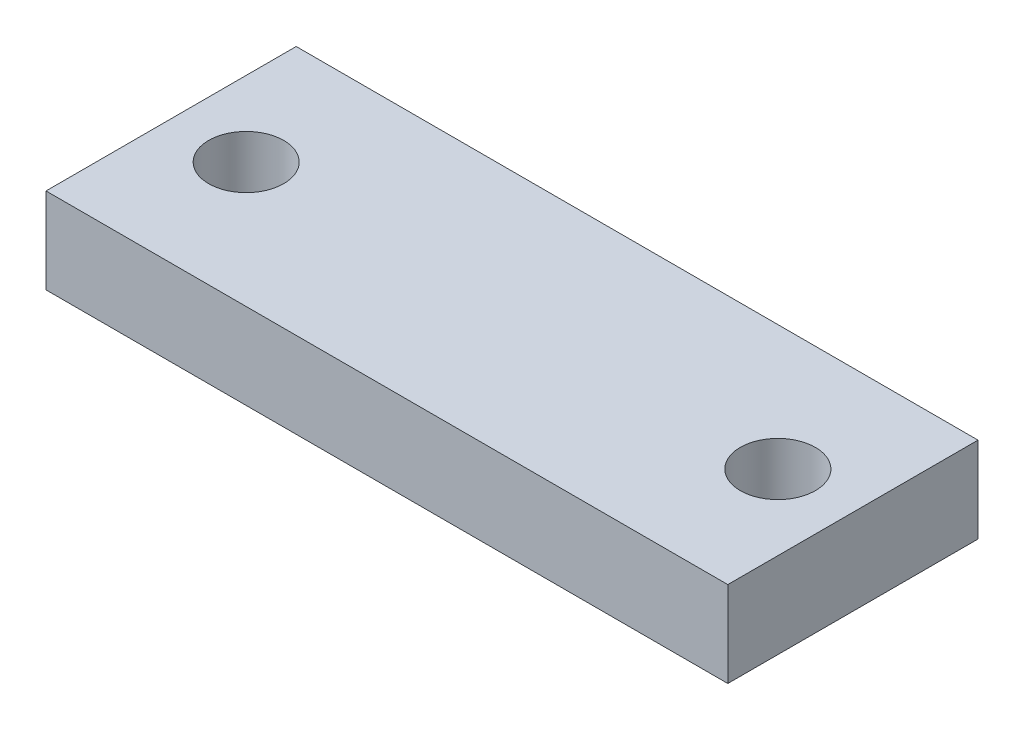
ISO-10303-21;
HEADER;
FILE_DESCRIPTION(('STEP AP214'),'2;1');
FILE_NAME('part.step','',(''),(''),'','','');
FILE_SCHEMA(('AUTOMOTIVE_DESIGN { 1 0 10303 214 1 1 1 1 }'));
ENDSEC;
DATA;
#1=APPLICATION_CONTEXT('core data for automotive mechanical design processes');
#2=APPLICATION_PROTOCOL_DEFINITION('international standard','automotive_design',2000,#1);
#3=PRODUCT_CONTEXT('',#1,'mechanical');
#4=PRODUCT('Part','Part','',(#3));
#5=PRODUCT_RELATED_PRODUCT_CATEGORY('part','',(#4));
#6=PRODUCT_DEFINITION_FORMATION('','',#4);
#7=PRODUCT_DEFINITION_CONTEXT('part definition',#1,'design');
#8=PRODUCT_DEFINITION('design','',#6,#7);
#9=PRODUCT_DEFINITION_SHAPE('','',#8);
#10=(LENGTH_UNIT() NAMED_UNIT(*) SI_UNIT(.MILLI.,.METRE.));
#11=(NAMED_UNIT(*) PLANE_ANGLE_UNIT() SI_UNIT($,.RADIAN.));
#12=(NAMED_UNIT(*) SI_UNIT($,.STERADIAN.) SOLID_ANGLE_UNIT());
#13=UNCERTAINTY_MEASURE_WITH_UNIT(LENGTH_MEASURE(1.E-05),#10,'distance_accuracy_value','');
#14=(GEOMETRIC_REPRESENTATION_CONTEXT(3) GLOBAL_UNCERTAINTY_ASSIGNED_CONTEXT((#13)) GLOBAL_UNIT_ASSIGNED_CONTEXT((#10,
#11,#12)) REPRESENTATION_CONTEXT('',''));
#15=CARTESIAN_POINT('',(0.,0.,0.));
#16=DIRECTION('',(0.,0.,1.));
#17=DIRECTION('',(1.,0.,0.));
#18=AXIS2_PLACEMENT_3D('',#15,#16,#17);
#19=CARTESIAN_POINT('',(0.,6.85,0.));
#20=DIRECTION('',(0.,1.,0.));
#21=DIRECTION('',(0.,0.,1.));
#22=AXIS2_PLACEMENT_3D('',#19,#20,#21);
#23=PLANE('',#22);
#24=CARTESIAN_POINT('',(48.5,6.85,10.));
#25=DIRECTION('',(0.,1.,0.));
#26=DIRECTION('',(0.,0.,1.));
#27=AXIS2_PLACEMENT_3D('',#24,#25,#26);
#28=CIRCLE('',#27,3.);
#29=CARTESIAN_POINT('',(48.5,6.85,7.));
#30=VERTEX_POINT('',#29);
#31=EDGE_CURVE('E106',#30,#30,#28,.T.);
#32=ORIENTED_EDGE('',*,*,#31,.F.);
#33=EDGE_LOOP('',(#32));
#34=FACE_BOUND('',#33,.T.);
#35=DIRECTION('',(0.,0.,1.));
#36=VECTOR('',#35,1.);
#37=CARTESIAN_POINT('',(0.,6.85,0.));
#38=LINE('',#37,#36);
#39=CARTESIAN_POINT('',(0.,6.85,0.));
#40=VERTEX_POINT('',#39);
#41=CARTESIAN_POINT('',(0.,6.85,20.));
#42=VERTEX_POINT('',#41);
#43=EDGE_CURVE('E91',#40,#42,#38,.T.);
#44=ORIENTED_EDGE('',*,*,#43,.T.);
#45=DIRECTION('',(1.,0.,0.));
#46=VECTOR('',#45,1.);
#47=CARTESIAN_POINT('',(0.,6.85,20.));
#48=LINE('',#47,#46);
#49=CARTESIAN_POINT('',(54.5,6.85,20.));
#50=VERTEX_POINT('',#49);
#51=EDGE_CURVE('E86',#42,#50,#48,.T.);
#52=ORIENTED_EDGE('',*,*,#51,.T.);
#53=DIRECTION('',(0.,0.,-1.));
#54=VECTOR('',#53,1.);
#55=CARTESIAN_POINT('',(54.5,6.85,0.));
#56=LINE('',#55,#54);
#57=CARTESIAN_POINT('',(54.5,6.85,0.));
#58=VERTEX_POINT('',#57);
#59=EDGE_CURVE('E89',#50,#58,#56,.T.);
#60=ORIENTED_EDGE('',*,*,#59,.T.);
#61=DIRECTION('',(-1.,0.,0.));
#62=VECTOR('',#61,1.);
#63=CARTESIAN_POINT('',(0.,6.85,0.));
#64=LINE('',#63,#62);
#65=EDGE_CURVE('E56',#58,#40,#64,.T.);
#66=ORIENTED_EDGE('',*,*,#65,.T.);
#67=EDGE_LOOP('',(#44,#52,#60,#66));
#68=FACE_BOUND('',#67,.T.);
#69=CARTESIAN_POINT('',(6.,6.85,10.));
#70=DIRECTION('',(0.,1.,0.));
#71=DIRECTION('',(0.,0.,-1.));
#72=AXIS2_PLACEMENT_3D('',#69,#70,#71);
#73=CIRCLE('',#72,3.00000000000001);
#74=CARTESIAN_POINT('',(6.,6.85,7.));
#75=VERTEX_POINT('',#74);
#76=EDGE_CURVE('E121',#75,#75,#73,.T.);
#77=ORIENTED_EDGE('',*,*,#76,.F.);
#78=EDGE_LOOP('',(#77));
#79=FACE_BOUND('',#78,.T.);
#80=ADVANCED_FACE('F39',(#34,#68,#79),#23,.T.);
#81=CARTESIAN_POINT('',(0.,0.,0.));
#82=DIRECTION('',(0.,1.,0.));
#83=DIRECTION('',(0.,0.,1.));
#84=AXIS2_PLACEMENT_3D('',#81,#82,#83);
#85=PLANE('',#84);
#86=DIRECTION('',(0.,0.,1.));
#87=VECTOR('',#86,1.);
#88=CARTESIAN_POINT('',(0.,0.,0.));
#89=LINE('',#88,#87);
#90=CARTESIAN_POINT('',(0.,0.,0.));
#91=VERTEX_POINT('',#90);
#92=CARTESIAN_POINT('',(0.,0.,20.));
#93=VERTEX_POINT('',#92);
#94=EDGE_CURVE('E103',#91,#93,#89,.T.);
#95=ORIENTED_EDGE('',*,*,#94,.F.);
#96=DIRECTION('',(-1.,0.,0.));
#97=VECTOR('',#96,1.);
#98=CARTESIAN_POINT('',(0.,0.,0.));
#99=LINE('',#98,#97);
#100=CARTESIAN_POINT('',(54.5,0.,0.));
#101=VERTEX_POINT('',#100);
#102=EDGE_CURVE('E79',#101,#91,#99,.T.);
#103=ORIENTED_EDGE('',*,*,#102,.F.);
#104=DIRECTION('',(0.,0.,-1.));
#105=VECTOR('',#104,1.);
#106=CARTESIAN_POINT('',(54.5,0.,0.));
#107=LINE('',#106,#105);
#108=CARTESIAN_POINT('',(54.5,0.,20.));
#109=VERTEX_POINT('',#108);
#110=EDGE_CURVE('E73',#109,#101,#107,.T.);
#111=ORIENTED_EDGE('',*,*,#110,.F.);
#112=DIRECTION('',(1.,0.,0.));
#113=VECTOR('',#112,1.);
#114=CARTESIAN_POINT('',(0.,0.,20.));
#115=LINE('',#114,#113);
#116=EDGE_CURVE('E95',#93,#109,#115,.T.);
#117=ORIENTED_EDGE('',*,*,#116,.F.);
#118=EDGE_LOOP('',(#95,#103,#111,#117));
#119=FACE_BOUND('',#118,.T.);
#120=CARTESIAN_POINT('',(48.5,0.,10.));
#121=DIRECTION('',(0.,1.,0.));
#122=DIRECTION('',(0.,0.,1.));
#123=AXIS2_PLACEMENT_3D('',#120,#121,#122);
#124=CIRCLE('',#123,3.);
#125=CARTESIAN_POINT('',(48.5,0.,7.));
#126=VERTEX_POINT('',#125);
#127=EDGE_CURVE('E118',#126,#126,#124,.T.);
#128=ORIENTED_EDGE('',*,*,#127,.T.);
#129=EDGE_LOOP('',(#128));
#130=FACE_BOUND('',#129,.T.);
#131=CARTESIAN_POINT('',(6.,0.,10.));
#132=DIRECTION('',(0.,1.,0.));
#133=DIRECTION('',(0.,0.,-1.));
#134=AXIS2_PLACEMENT_3D('',#131,#132,#133);
#135=CIRCLE('',#134,3.00000000000001);
#136=CARTESIAN_POINT('',(6.,0.,7.));
#137=VERTEX_POINT('',#136);
#138=EDGE_CURVE('E124',#137,#137,#135,.T.);
#139=ORIENTED_EDGE('',*,*,#138,.T.);
#140=EDGE_LOOP('',(#139));
#141=FACE_BOUND('',#140,.T.);
#142=ADVANCED_FACE('F114',(#119,#130,#141),#85,.F.);
#143=CARTESIAN_POINT('',(0.,6.85,0.));
#144=DIRECTION('',(1.,0.,0.));
#145=DIRECTION('',(0.,0.,-1.));
#146=AXIS2_PLACEMENT_3D('',#143,#144,#145);
#147=PLANE('',#146);
#148=ORIENTED_EDGE('',*,*,#94,.T.);
#149=DIRECTION('',(0.,-1.,0.));
#150=VECTOR('',#149,1.);
#151=CARTESIAN_POINT('',(0.,6.85,20.));
#152=LINE('',#151,#150);
#153=EDGE_CURVE('E11',#42,#93,#152,.T.);
#154=ORIENTED_EDGE('',*,*,#153,.F.);
#155=ORIENTED_EDGE('',*,*,#43,.F.);
#156=DIRECTION('',(0.,-1.,0.));
#157=VECTOR('',#156,1.);
#158=CARTESIAN_POINT('',(0.,6.85,0.));
#159=LINE('',#158,#157);
#160=EDGE_CURVE('E99',#40,#91,#159,.T.);
#161=ORIENTED_EDGE('',*,*,#160,.T.);
#162=EDGE_LOOP('',(#148,#154,#155,#161));
#163=FACE_BOUND('',#162,.T.);
#164=ADVANCED_FACE('F41',(#163),#147,.F.);
#165=CARTESIAN_POINT('',(0.,6.85,20.));
#166=DIRECTION('',(0.,0.,-1.));
#167=DIRECTION('',(-1.,0.,0.));
#168=AXIS2_PLACEMENT_3D('',#165,#166,#167);
#169=PLANE('',#168);
#170=ORIENTED_EDGE('',*,*,#116,.T.);
#171=DIRECTION('',(0.,-1.,0.));
#172=VECTOR('',#171,1.);
#173=CARTESIAN_POINT('',(54.5,6.85,20.));
#174=LINE('',#173,#172);
#175=EDGE_CURVE('E48',#50,#109,#174,.T.);
#176=ORIENTED_EDGE('',*,*,#175,.F.);
#177=ORIENTED_EDGE('',*,*,#51,.F.);
#178=ORIENTED_EDGE('',*,*,#153,.T.);
#179=EDGE_LOOP('',(#170,#176,#177,#178));
#180=FACE_BOUND('',#179,.T.);
#181=ADVANCED_FACE('F94',(#180),#169,.F.);
#182=CARTESIAN_POINT('',(54.5,6.85,0.));
#183=DIRECTION('',(-1.,0.,0.));
#184=DIRECTION('',(0.,0.,1.));
#185=AXIS2_PLACEMENT_3D('',#182,#183,#184);
#186=PLANE('',#185);
#187=ORIENTED_EDGE('',*,*,#110,.T.);
#188=DIRECTION('',(0.,-1.,0.));
#189=VECTOR('',#188,1.);
#190=CARTESIAN_POINT('',(54.5,6.85,0.));
#191=LINE('',#190,#189);
#192=EDGE_CURVE('E96',#58,#101,#191,.T.);
#193=ORIENTED_EDGE('',*,*,#192,.F.);
#194=ORIENTED_EDGE('',*,*,#59,.F.);
#195=ORIENTED_EDGE('',*,*,#175,.T.);
#196=EDGE_LOOP('',(#187,#193,#194,#195));
#197=FACE_BOUND('',#196,.T.);
#198=ADVANCED_FACE('F97',(#197),#186,.F.);
#199=CARTESIAN_POINT('',(0.,6.85,0.));
#200=DIRECTION('',(0.,0.,1.));
#201=DIRECTION('',(1.,0.,0.));
#202=AXIS2_PLACEMENT_3D('',#199,#200,#201);
#203=PLANE('',#202);
#204=ORIENTED_EDGE('',*,*,#102,.T.);
#205=ORIENTED_EDGE('',*,*,#160,.F.);
#206=ORIENTED_EDGE('',*,*,#65,.F.);
#207=ORIENTED_EDGE('',*,*,#192,.T.);
#208=EDGE_LOOP('',(#204,#205,#206,#207));
#209=FACE_BOUND('',#208,.T.);
#210=ADVANCED_FACE('F111',(#209),#203,.F.);
#211=CARTESIAN_POINT('',(48.5,6.85,10.));
#212=DIRECTION('',(0.,-1.,0.));
#213=DIRECTION('',(0.,0.,-1.));
#214=AXIS2_PLACEMENT_3D('',#211,#212,#213);
#215=CYLINDRICAL_SURFACE('',#214,3.);
#216=CARTESIAN_POINT('',(48.5,6.85,7.));
#217=CARTESIAN_POINT('',(48.5,6.77864583333333,7.));
#218=CARTESIAN_POINT('',(48.5,6.70729166666667,7.));
#219=CARTESIAN_POINT('',(48.5,6.56458333333333,7.));
#220=CARTESIAN_POINT('',(48.5,6.49322916666667,7.));
#221=CARTESIAN_POINT('',(48.5,6.35052083333333,7.));
#222=CARTESIAN_POINT('',(48.5,6.27916666666667,7.));
#223=CARTESIAN_POINT('',(48.5,6.13645833333333,7.));
#224=CARTESIAN_POINT('',(48.5,6.06510416666667,7.));
#225=CARTESIAN_POINT('',(48.5,5.92239583333333,7.));
#226=CARTESIAN_POINT('',(48.5,5.85104166666667,7.));
#227=CARTESIAN_POINT('',(48.5,5.70833333333333,7.));
#228=CARTESIAN_POINT('',(48.5,5.63697916666667,7.));
#229=CARTESIAN_POINT('',(48.5,5.49427083333333,7.));
#230=CARTESIAN_POINT('',(48.5,5.42291666666667,7.));
#231=CARTESIAN_POINT('',(48.5,5.28020833333333,7.));
#232=CARTESIAN_POINT('',(48.5,5.20885416666667,7.));
#233=CARTESIAN_POINT('',(48.5,5.06614583333333,7.));
#234=CARTESIAN_POINT('',(48.5,4.99479166666667,7.));
#235=CARTESIAN_POINT('',(48.5,4.85208333333333,7.));
#236=CARTESIAN_POINT('',(48.5,4.78072916666667,7.));
#237=CARTESIAN_POINT('',(48.5,4.63802083333333,7.));
#238=CARTESIAN_POINT('',(48.5,4.56666666666667,7.));
#239=CARTESIAN_POINT('',(48.5,4.42395833333333,7.));
#240=CARTESIAN_POINT('',(48.5,4.35260416666667,7.));
#241=CARTESIAN_POINT('',(48.5,4.20989583333333,7.));
#242=CARTESIAN_POINT('',(48.5,4.13854166666667,7.));
#243=CARTESIAN_POINT('',(48.5,3.99583333333333,7.));
#244=CARTESIAN_POINT('',(48.5,3.92447916666667,7.));
#245=CARTESIAN_POINT('',(48.5,3.78177083333333,7.));
#246=CARTESIAN_POINT('',(48.5,3.71041666666667,7.));
#247=CARTESIAN_POINT('',(48.5,3.56770833333333,7.));
#248=CARTESIAN_POINT('',(48.5,3.49635416666667,7.));
#249=CARTESIAN_POINT('',(48.5,3.35364583333333,7.));
#250=CARTESIAN_POINT('',(48.5,3.28229166666667,7.));
#251=CARTESIAN_POINT('',(48.5,3.13958333333333,7.));
#252=CARTESIAN_POINT('',(48.5,3.06822916666667,7.));
#253=CARTESIAN_POINT('',(48.5,2.92552083333333,7.));
#254=CARTESIAN_POINT('',(48.5,2.85416666666667,7.));
#255=CARTESIAN_POINT('',(48.5,2.71145833333333,7.));
#256=CARTESIAN_POINT('',(48.5,2.64010416666667,7.));
#257=CARTESIAN_POINT('',(48.5,2.49739583333333,7.));
#258=CARTESIAN_POINT('',(48.5,2.42604166666667,7.));
#259=CARTESIAN_POINT('',(48.5,2.28333333333333,7.));
#260=CARTESIAN_POINT('',(48.5,2.21197916666667,7.));
#261=CARTESIAN_POINT('',(48.5,2.06927083333333,7.));
#262=CARTESIAN_POINT('',(48.5,1.99791666666667,7.));
#263=CARTESIAN_POINT('',(48.5,1.85520833333333,7.));
#264=CARTESIAN_POINT('',(48.5,1.78385416666667,7.));
#265=CARTESIAN_POINT('',(48.5,1.64114583333333,7.));
#266=CARTESIAN_POINT('',(48.5,1.56979166666667,7.));
#267=CARTESIAN_POINT('',(48.5,1.42708333333333,7.));
#268=CARTESIAN_POINT('',(48.5,1.35572916666667,7.));
#269=CARTESIAN_POINT('',(48.5,1.21302083333333,7.));
#270=CARTESIAN_POINT('',(48.5,1.14166666666667,7.));
#271=CARTESIAN_POINT('',(48.5,0.998958333333334,7.));
#272=CARTESIAN_POINT('',(48.5,0.927604166666667,7.));
#273=CARTESIAN_POINT('',(48.5,0.784895833333334,7.));
#274=CARTESIAN_POINT('',(48.5,0.713541666666667,7.));
#275=CARTESIAN_POINT('',(48.5,0.570833333333333,7.));
#276=CARTESIAN_POINT('',(48.5,0.499479166666667,7.));
#277=CARTESIAN_POINT('',(48.5,0.356770833333333,7.));
#278=CARTESIAN_POINT('',(48.5,0.285416666666666,7.));
#279=CARTESIAN_POINT('',(48.5,0.142708333333333,7.));
#280=CARTESIAN_POINT('',(48.5,0.0713541666666667,7.));
#281=CARTESIAN_POINT('',(48.5,0.,7.));
#282=B_SPLINE_CURVE_WITH_KNOTS('',3,(#216,#217,#218,#219,#220,#221,#222,#223,#224,#225,#226,
#227,#228,#229,#230,#231,#232,#233,#234,#235,#236,#237,#238,#239,#240,#241,#242,#243,#244,#245,
#246,#247,#248,#249,#250,#251,#252,#253,#254,#255,#256,#257,#258,#259,#260,#261,#262,#263,#264,
#265,#266,#267,#268,#269,#270,#271,#272,#273,#274,#275,#276,#277,#278,#279,#280,#281),
.UNSPECIFIED.,.F.,.F.,(4,2,2,2,2,2,2,2,2,2,2,2,2,2,2,2,2,2,2,2,2,2,2,2,2,2,2,2,2,2,2,2,4),(0.,
0.214062500000001,0.428125000000001,0.6421875,0.85625,1.0703125,1.284375,1.4984375,1.7125,
1.9265625,2.140625,2.3546875,2.56875,2.7828125,2.996875,3.2109375,3.425,3.6390625,3.853125,
4.0671875,4.28125,4.4953125,4.709375,4.9234375,5.1375,5.3515625,5.565625,5.7796875,5.99375,
6.2078125,6.421875,6.6359375,6.85),.UNSPECIFIED.);
#283=EDGE_CURVE('BSEAM141',#30,#126,#282,.T.);
#284=ORIENTED_EDGE('',*,*,#31,.T.);
#285=ORIENTED_EDGE('',*,*,#127,.F.);
#286=ORIENTED_EDGE('',*,*,#283,.T.);
#287=ORIENTED_EDGE('',*,*,#283,.F.);
#288=EDGE_LOOP('',(#284,#286,#285,#287));
#289=FACE_BOUND('',#288,.T.);
#290=ADVANCED_FACE('F141',(#289),#215,.F.);
#291=CARTESIAN_POINT('',(6.,6.85,10.));
#292=DIRECTION('',(0.,-1.,0.));
#293=DIRECTION('',(0.,0.,-1.));
#294=AXIS2_PLACEMENT_3D('',#291,#292,#293);
#295=CYLINDRICAL_SURFACE('',#294,3.00000000000001);
#296=CARTESIAN_POINT('',(6.,6.85,7.));
#297=CARTESIAN_POINT('',(6.,6.77864583333333,7.));
#298=CARTESIAN_POINT('',(6.,6.70729166666667,7.));
#299=CARTESIAN_POINT('',(6.,6.56458333333333,7.));
#300=CARTESIAN_POINT('',(6.,6.49322916666667,7.));
#301=CARTESIAN_POINT('',(6.,6.35052083333333,7.));
#302=CARTESIAN_POINT('',(6.,6.27916666666667,7.));
#303=CARTESIAN_POINT('',(6.,6.13645833333333,7.));
#304=CARTESIAN_POINT('',(6.,6.06510416666667,7.));
#305=CARTESIAN_POINT('',(6.,5.92239583333333,7.));
#306=CARTESIAN_POINT('',(6.,5.85104166666667,7.));
#307=CARTESIAN_POINT('',(6.,5.70833333333333,7.));
#308=CARTESIAN_POINT('',(6.,5.63697916666667,7.));
#309=CARTESIAN_POINT('',(6.,5.49427083333333,7.));
#310=CARTESIAN_POINT('',(6.,5.42291666666667,7.));
#311=CARTESIAN_POINT('',(6.,5.28020833333333,7.));
#312=CARTESIAN_POINT('',(6.,5.20885416666667,7.));
#313=CARTESIAN_POINT('',(6.,5.06614583333333,7.));
#314=CARTESIAN_POINT('',(6.,4.99479166666667,7.));
#315=CARTESIAN_POINT('',(6.,4.85208333333333,7.));
#316=CARTESIAN_POINT('',(6.,4.78072916666667,7.));
#317=CARTESIAN_POINT('',(6.,4.63802083333333,7.));
#318=CARTESIAN_POINT('',(6.,4.56666666666667,7.));
#319=CARTESIAN_POINT('',(6.,4.42395833333333,7.));
#320=CARTESIAN_POINT('',(6.,4.35260416666667,7.));
#321=CARTESIAN_POINT('',(6.,4.20989583333333,7.));
#322=CARTESIAN_POINT('',(6.,4.13854166666667,7.));
#323=CARTESIAN_POINT('',(6.,3.99583333333333,7.));
#324=CARTESIAN_POINT('',(6.,3.92447916666667,7.));
#325=CARTESIAN_POINT('',(6.,3.78177083333333,7.));
#326=CARTESIAN_POINT('',(6.,3.71041666666667,7.));
#327=CARTESIAN_POINT('',(6.,3.56770833333333,7.));
#328=CARTESIAN_POINT('',(6.,3.49635416666667,7.));
#329=CARTESIAN_POINT('',(6.,3.35364583333333,7.));
#330=CARTESIAN_POINT('',(6.,3.28229166666667,7.));
#331=CARTESIAN_POINT('',(6.,3.13958333333333,7.));
#332=CARTESIAN_POINT('',(6.,3.06822916666667,7.));
#333=CARTESIAN_POINT('',(6.,2.92552083333333,7.));
#334=CARTESIAN_POINT('',(6.,2.85416666666667,7.));
#335=CARTESIAN_POINT('',(6.,2.71145833333333,7.));
#336=CARTESIAN_POINT('',(6.,2.64010416666667,7.));
#337=CARTESIAN_POINT('',(6.,2.49739583333333,7.));
#338=CARTESIAN_POINT('',(6.,2.42604166666667,7.));
#339=CARTESIAN_POINT('',(6.,2.28333333333333,7.));
#340=CARTESIAN_POINT('',(6.,2.21197916666667,7.));
#341=CARTESIAN_POINT('',(6.,2.06927083333333,7.));
#342=CARTESIAN_POINT('',(6.,1.99791666666667,7.));
#343=CARTESIAN_POINT('',(6.,1.85520833333333,7.));
#344=CARTESIAN_POINT('',(6.,1.78385416666667,7.));
#345=CARTESIAN_POINT('',(6.,1.64114583333333,7.));
#346=CARTESIAN_POINT('',(6.,1.56979166666667,7.));
#347=CARTESIAN_POINT('',(6.,1.42708333333333,7.));
#348=CARTESIAN_POINT('',(6.,1.35572916666667,7.));
#349=CARTESIAN_POINT('',(6.,1.21302083333333,7.));
#350=CARTESIAN_POINT('',(6.,1.14166666666667,7.));
#351=CARTESIAN_POINT('',(6.,0.998958333333334,7.));
#352=CARTESIAN_POINT('',(6.,0.927604166666667,7.));
#353=CARTESIAN_POINT('',(6.,0.784895833333334,7.));
#354=CARTESIAN_POINT('',(6.,0.713541666666667,7.));
#355=CARTESIAN_POINT('',(6.,0.570833333333333,7.));
#356=CARTESIAN_POINT('',(6.,0.499479166666667,7.));
#357=CARTESIAN_POINT('',(6.,0.356770833333333,7.));
#358=CARTESIAN_POINT('',(6.,0.285416666666666,7.));
#359=CARTESIAN_POINT('',(6.,0.142708333333333,7.));
#360=CARTESIAN_POINT('',(6.,0.0713541666666667,7.));
#361=CARTESIAN_POINT('',(6.,0.,7.));
#362=B_SPLINE_CURVE_WITH_KNOTS('',3,(#296,#297,#298,#299,#300,#301,#302,#303,#304,#305,#306,
#307,#308,#309,#310,#311,#312,#313,#314,#315,#316,#317,#318,#319,#320,#321,#322,#323,#324,#325,
#326,#327,#328,#329,#330,#331,#332,#333,#334,#335,#336,#337,#338,#339,#340,#341,#342,#343,#344,
#345,#346,#347,#348,#349,#350,#351,#352,#353,#354,#355,#356,#357,#358,#359,#360,#361),
.UNSPECIFIED.,.F.,.F.,(4,2,2,2,2,2,2,2,2,2,2,2,2,2,2,2,2,2,2,2,2,2,2,2,2,2,2,2,2,2,2,2,4),(0.,
0.214062500000001,0.428125000000001,0.6421875,0.85625,1.0703125,1.284375,1.4984375,1.7125,
1.9265625,2.140625,2.3546875,2.56875,2.7828125,2.996875,3.2109375,3.425,3.6390625,3.853125,
4.0671875,4.28125,4.4953125,4.709375,4.9234375,5.1375,5.3515625,5.565625,5.7796875,5.99375,
6.2078125,6.421875,6.6359375,6.85),.UNSPECIFIED.);
#363=EDGE_CURVE('BSEAM130',#75,#137,#362,.T.);
#364=ORIENTED_EDGE('',*,*,#76,.T.);
#365=ORIENTED_EDGE('',*,*,#138,.F.);
#366=ORIENTED_EDGE('',*,*,#363,.T.);
#367=ORIENTED_EDGE('',*,*,#363,.F.);
#368=EDGE_LOOP('',(#364,#366,#365,#367));
#369=FACE_BOUND('',#368,.T.);
#370=ADVANCED_FACE('F130',(#369),#295,.F.);
#371=CLOSED_SHELL('',(#80,#142,#164,#181,#198,#210,#290,#370));
#372=MANIFOLD_SOLID_BREP('B2',#371);
#373=ADVANCED_BREP_SHAPE_REPRESENTATION('',(#18,#372),#14);
#374=SHAPE_DEFINITION_REPRESENTATION(#9,#373);
ENDSEC;
END-ISO-10303-21;
